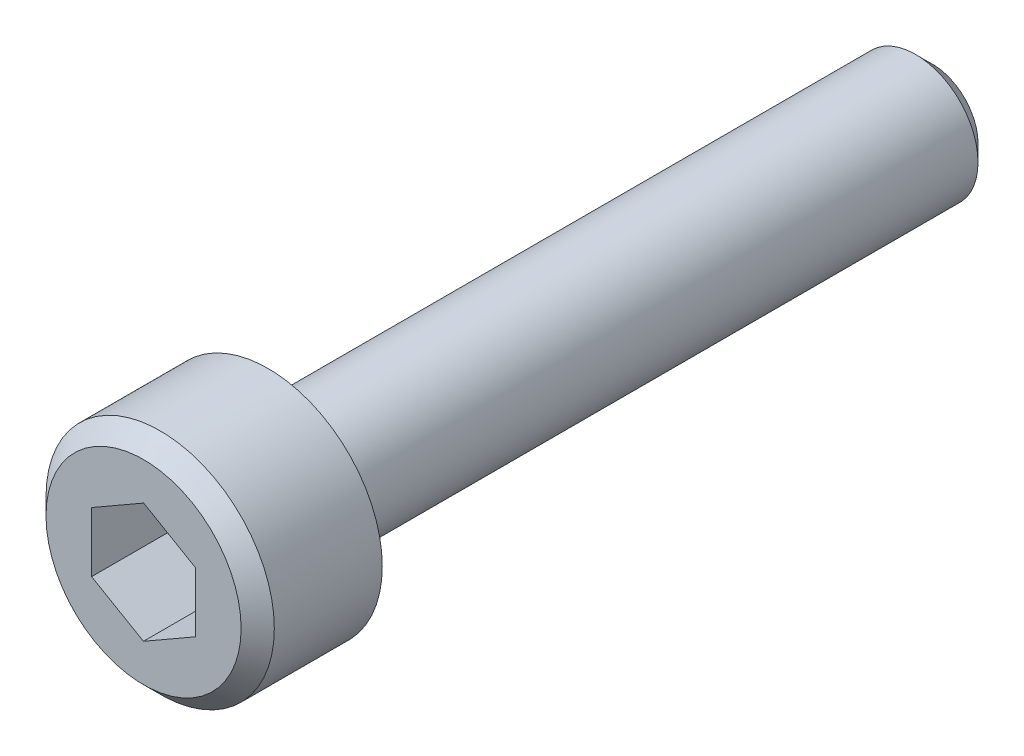
ISO-10303-21;
HEADER;
FILE_DESCRIPTION(('STEP AP214'),'2;1');
FILE_NAME('part.step','',(''),(''),'','','');
FILE_SCHEMA(('AUTOMOTIVE_DESIGN { 1 0 10303 214 1 1 1 1 }'));
ENDSEC;
DATA;
#1=APPLICATION_CONTEXT('core data for automotive mechanical design processes');
#2=APPLICATION_PROTOCOL_DEFINITION('international standard','automotive_design',2000,#1);
#3=PRODUCT_CONTEXT('',#1,'mechanical');
#4=PRODUCT('Part','Part','',(#3));
#5=PRODUCT_RELATED_PRODUCT_CATEGORY('part','',(#4));
#6=PRODUCT_DEFINITION_FORMATION('','',#4);
#7=PRODUCT_DEFINITION_CONTEXT('part definition',#1,'design');
#8=PRODUCT_DEFINITION('design','',#6,#7);
#9=PRODUCT_DEFINITION_SHAPE('','',#8);
#10=(LENGTH_UNIT() NAMED_UNIT(*) SI_UNIT(.MILLI.,.METRE.));
#11=(NAMED_UNIT(*) PLANE_ANGLE_UNIT() SI_UNIT($,.RADIAN.));
#12=(NAMED_UNIT(*) SI_UNIT($,.STERADIAN.) SOLID_ANGLE_UNIT());
#13=UNCERTAINTY_MEASURE_WITH_UNIT(LENGTH_MEASURE(1.E-05),#10,'distance_accuracy_value','');
#14=(GEOMETRIC_REPRESENTATION_CONTEXT(3) GLOBAL_UNCERTAINTY_ASSIGNED_CONTEXT((#13)) GLOBAL_UNIT_ASSIGNED_CONTEXT((#10,
#11,#12)) REPRESENTATION_CONTEXT('',''));
#15=CARTESIAN_POINT('',(0.,0.,0.));
#16=DIRECTION('',(0.,0.,1.));
#17=DIRECTION('',(1.,0.,0.));
#18=AXIS2_PLACEMENT_3D('',#15,#16,#17);
#19=CARTESIAN_POINT('',(-0.002966907876081,-1.44337262368073,0.5));
#20=DIRECTION('',(0.498218798968152,-0.867051341244988,0.));
#21=DIRECTION('',(0.867051341244988,0.498218798968152,0.));
#22=AXIS2_PLACEMENT_3D('',#19,#20,#21);
#23=PLANE('',#22);
#24=DIRECTION('',(0.,0.,1.));
#25=VECTOR('',#24,1.);
#26=CARTESIAN_POINT('',(1.24851390529647,-0.72425572943174,0.5));
#27=LINE('',#26,#25);
#28=CARTESIAN_POINT('',(1.24851390529647,-0.72425572943174,3.));
#29=VERTEX_POINT('',#28);
#30=CARTESIAN_POINT('',(1.24851390529647,-0.72425572943174,0.5));
#31=VERTEX_POINT('',#30);
#32=EDGE_CURVE('E82',#29,#31,#27,.F.);
#33=ORIENTED_EDGE('',*,*,#32,.T.);
#34=DIRECTION('',(0.867051341244988,0.498218798968152,0.));
#35=VECTOR('',#34,1.);
#36=CARTESIAN_POINT('',(-0.002966907876081,-1.44337262368073,0.5));
#37=LINE('',#36,#35);
#38=CARTESIAN_POINT('',(-0.0029669078760811,-1.44337262368073,0.5));
#39=VERTEX_POINT('',#38);
#40=EDGE_CURVE('E71',#39,#31,#37,.T.);
#41=ORIENTED_EDGE('',*,*,#40,.F.);
#42=DIRECTION('',(0.,0.,1.));
#43=VECTOR('',#42,1.);
#44=CARTESIAN_POINT('',(-0.00296690787608103,-1.44337262368073,0.5));
#45=LINE('',#44,#43);
#46=CARTESIAN_POINT('',(-0.00296690787608113,-1.44337262368073,3.));
#47=VERTEX_POINT('',#46);
#48=EDGE_CURVE('E91',#39,#47,#45,.T.);
#49=ORIENTED_EDGE('',*,*,#48,.T.);
#50=DIRECTION('',(0.867051341244988,0.498218798968152,0.));
#51=VECTOR('',#50,1.);
#52=CARTESIAN_POINT('',(-0.002966907876081,-1.44337262368073,3.));
#53=LINE('',#52,#51);
#54=EDGE_CURVE('E66',#29,#47,#53,.F.);
#55=ORIENTED_EDGE('',*,*,#54,.F.);
#56=EDGE_LOOP('',(#33,#41,#49,#55));
#57=FACE_BOUND('',#56,.T.);
#58=ADVANCED_FACE('F16',(#57),#23,.F.);
#59=CARTESIAN_POINT('',(1.24851390529647,-0.72425572943174,0.5));
#60=DIRECTION('',(0.999997887387606,-0.0020555340731014,0.));
#61=DIRECTION('',(0.0020555340731014,0.999997887387606,0.));
#62=AXIS2_PLACEMENT_3D('',#59,#60,#61);
#63=PLANE('',#62);
#64=DIRECTION('',(0.,0.,1.));
#65=VECTOR('',#64,1.);
#66=CARTESIAN_POINT('',(1.25148081317255,0.719116894248987,0.5));
#67=LINE('',#66,#65);
#68=CARTESIAN_POINT('',(1.25148081317255,0.719116894248987,3.));
#69=VERTEX_POINT('',#68);
#70=CARTESIAN_POINT('',(1.25148081317255,0.719116894248987,0.5));
#71=VERTEX_POINT('',#70);
#72=EDGE_CURVE('E87',#69,#71,#67,.F.);
#73=ORIENTED_EDGE('',*,*,#72,.T.);
#74=DIRECTION('',(0.0020555340731014,0.999997887387606,0.));
#75=VECTOR('',#74,1.);
#76=CARTESIAN_POINT('',(1.24851390529647,-0.72425572943174,0.5));
#77=LINE('',#76,#75);
#78=EDGE_CURVE('E75',#31,#71,#77,.T.);
#79=ORIENTED_EDGE('',*,*,#78,.F.);
#80=ORIENTED_EDGE('',*,*,#32,.F.);
#81=DIRECTION('',(0.0020555340731014,0.999997887387606,0.));
#82=VECTOR('',#81,1.);
#83=CARTESIAN_POINT('',(1.24851390529647,-0.72425572943174,3.));
#84=LINE('',#83,#82);
#85=EDGE_CURVE('E89',#69,#29,#84,.F.);
#86=ORIENTED_EDGE('',*,*,#85,.F.);
#87=EDGE_LOOP('',(#73,#79,#80,#86));
#88=FACE_BOUND('',#87,.T.);
#89=ADVANCED_FACE('F85',(#88),#63,.F.);
#90=CARTESIAN_POINT('',(-1.25148081317255,-0.719116894248988,0.5));
#91=DIRECTION('',(-0.501779088419452,-0.864995807171887,0.));
#92=DIRECTION('',(0.864995807171887,-0.501779088419452,0.));
#93=AXIS2_PLACEMENT_3D('',#90,#91,#92);
#94=PLANE('',#93);
#95=ORIENTED_EDGE('',*,*,#48,.F.);
#96=DIRECTION('',(0.864995807171887,-0.501779088419452,0.));
#97=VECTOR('',#96,1.);
#98=CARTESIAN_POINT('',(-1.25148081317255,-0.719116894248988,0.5));
#99=LINE('',#98,#97);
#100=CARTESIAN_POINT('',(-1.25148081317255,-0.719116894248988,0.5));
#101=VERTEX_POINT('',#100);
#102=EDGE_CURVE('E78',#101,#39,#99,.T.);
#103=ORIENTED_EDGE('',*,*,#102,.F.);
#104=DIRECTION('',(0.,0.,1.));
#105=VECTOR('',#104,1.);
#106=CARTESIAN_POINT('',(-1.25148081317255,-0.719116894248988,0.5));
#107=LINE('',#106,#105);
#108=CARTESIAN_POINT('',(-1.25148081317255,-0.719116894248988,3.));
#109=VERTEX_POINT('',#108);
#110=EDGE_CURVE('E122',#101,#109,#107,.T.);
#111=ORIENTED_EDGE('',*,*,#110,.T.);
#112=DIRECTION('',(0.864995807171887,-0.501779088419452,0.));
#113=VECTOR('',#112,1.);
#114=CARTESIAN_POINT('',(-1.25148081317255,-0.719116894248988,3.));
#115=LINE('',#114,#113);
#116=EDGE_CURVE('E134',#47,#109,#115,.F.);
#117=ORIENTED_EDGE('',*,*,#116,.F.);
#118=EDGE_LOOP('',(#95,#103,#111,#117));
#119=FACE_BOUND('',#118,.T.);
#120=ADVANCED_FACE('F137',(#119),#94,.F.);
#121=CARTESIAN_POINT('',(1.25148081317255,0.719116894248987,0.5));
#122=DIRECTION('',(0.501779088419452,0.864995807171887,0.));
#123=DIRECTION('',(-0.864995807171887,0.501779088419452,0.));
#124=AXIS2_PLACEMENT_3D('',#121,#122,#123);
#125=PLANE('',#124);
#126=DIRECTION('',(0.,0.,1.));
#127=VECTOR('',#126,1.);
#128=CARTESIAN_POINT('',(0.00296690787608411,1.44337262368073,0.5));
#129=LINE('',#128,#127);
#130=CARTESIAN_POINT('',(0.00296690787608401,1.44337262368073,3.));
#131=VERTEX_POINT('',#130);
#132=CARTESIAN_POINT('',(0.00296690787608401,1.44337262368073,0.5));
#133=VERTEX_POINT('',#132);
#134=EDGE_CURVE('E119',#131,#133,#129,.F.);
#135=ORIENTED_EDGE('',*,*,#134,.T.);
#136=DIRECTION('',(-0.864995807171887,0.501779088419452,0.));
#137=VECTOR('',#136,1.);
#138=CARTESIAN_POINT('',(1.25148081317255,0.719116894248987,0.5));
#139=LINE('',#138,#137);
#140=EDGE_CURVE('E128',#71,#133,#139,.T.);
#141=ORIENTED_EDGE('',*,*,#140,.F.);
#142=ORIENTED_EDGE('',*,*,#72,.F.);
#143=DIRECTION('',(-0.864995807171887,0.501779088419452,0.));
#144=VECTOR('',#143,1.);
#145=CARTESIAN_POINT('',(1.25148081317255,0.719116894248987,3.));
#146=LINE('',#145,#144);
#147=EDGE_CURVE('E130',#131,#69,#146,.F.);
#148=ORIENTED_EDGE('',*,*,#147,.F.);
#149=EDGE_LOOP('',(#135,#141,#142,#148));
#150=FACE_BOUND('',#149,.T.);
#151=ADVANCED_FACE('F144',(#150),#125,.F.);
#152=CARTESIAN_POINT('',(0.00296690787608422,1.44337262368073,0.5));
#153=DIRECTION('',(0.,0.,1.));
#154=DIRECTION('',(1.,0.,0.));
#155=AXIS2_PLACEMENT_3D('',#152,#153,#154);
#156=PLANE('',#155);
#157=ORIENTED_EDGE('',*,*,#40,.T.);
#158=ORIENTED_EDGE('',*,*,#78,.T.);
#159=ORIENTED_EDGE('',*,*,#140,.T.);
#160=DIRECTION('',(-0.867051341244987,-0.498218798968153,0.));
#161=VECTOR('',#160,1.);
#162=CARTESIAN_POINT('',(0.002966907876084,1.44337262368073,0.5));
#163=LINE('',#162,#161);
#164=CARTESIAN_POINT('',(-1.24851390529646,0.724255729431739,0.5));
#165=VERTEX_POINT('',#164);
#166=EDGE_CURVE('E117',#133,#165,#163,.T.);
#167=ORIENTED_EDGE('',*,*,#166,.T.);
#168=DIRECTION('',(-0.0020555340731014,-0.999997887387606,0.));
#169=VECTOR('',#168,1.);
#170=CARTESIAN_POINT('',(-1.24851390529646,0.724255729431739,0.5));
#171=LINE('',#170,#169);
#172=EDGE_CURVE('E125',#165,#101,#171,.T.);
#173=ORIENTED_EDGE('',*,*,#172,.T.);
#174=ORIENTED_EDGE('',*,*,#102,.T.);
#175=EDGE_LOOP('',(#157,#158,#159,#167,#173,#174));
#176=FACE_BOUND('',#175,.T.);
#177=ADVANCED_FACE('F72',(#176),#156,.T.);
#178=CARTESIAN_POINT('',(-1.24851390529646,0.724255729431739,0.5));
#179=DIRECTION('',(-0.999997887387606,0.0020555340731014,0.));
#180=DIRECTION('',(-0.0020555340731014,-0.999997887387606,0.));
#181=AXIS2_PLACEMENT_3D('',#178,#179,#180);
#182=PLANE('',#181);
#183=ORIENTED_EDGE('',*,*,#110,.F.);
#184=ORIENTED_EDGE('',*,*,#172,.F.);
#185=DIRECTION('',(0.,0.,1.));
#186=VECTOR('',#185,1.);
#187=CARTESIAN_POINT('',(-1.24851390529646,0.724255729431739,0.5));
#188=LINE('',#187,#186);
#189=CARTESIAN_POINT('',(-1.24851390529646,0.724255729431739,3.));
#190=VERTEX_POINT('',#189);
#191=EDGE_CURVE('E115',#165,#190,#188,.T.);
#192=ORIENTED_EDGE('',*,*,#191,.T.);
#193=DIRECTION('',(-0.0020555340731014,-0.999997887387606,0.));
#194=VECTOR('',#193,1.);
#195=CARTESIAN_POINT('',(-1.24851390529646,0.724255729431739,3.));
#196=LINE('',#195,#194);
#197=EDGE_CURVE('E34',#109,#190,#196,.F.);
#198=ORIENTED_EDGE('',*,*,#197,.F.);
#199=EDGE_LOOP('',(#183,#184,#192,#198));
#200=FACE_BOUND('',#199,.T.);
#201=ADVANCED_FACE('F151',(#200),#182,.F.);
#202=CARTESIAN_POINT('',(0.002966907876084,1.44337262368073,0.5));
#203=DIRECTION('',(-0.498218798968153,0.867051341244987,0.));
#204=DIRECTION('',(-0.867051341244987,-0.498218798968153,0.));
#205=AXIS2_PLACEMENT_3D('',#202,#203,#204);
#206=PLANE('',#205);
#207=ORIENTED_EDGE('',*,*,#191,.F.);
#208=ORIENTED_EDGE('',*,*,#166,.F.);
#209=ORIENTED_EDGE('',*,*,#134,.F.);
#210=DIRECTION('',(0.867051341244987,0.498218798968153,0.));
#211=VECTOR('',#210,1.);
#212=CARTESIAN_POINT('',(-1.24851390529646,0.724255729431739,3.));
#213=LINE('',#212,#211);
#214=EDGE_CURVE('E111',#190,#131,#213,.T.);
#215=ORIENTED_EDGE('',*,*,#214,.F.);
#216=EDGE_LOOP('',(#207,#208,#209,#215));
#217=FACE_BOUND('',#216,.T.);
#218=ADVANCED_FACE('F149',(#217),#206,.F.);
#219=CARTESIAN_POINT('',(0.,0.,3.));
#220=DIRECTION('',(0.,0.,1.));
#221=DIRECTION('',(1.,0.,0.));
#222=AXIS2_PLACEMENT_3D('',#219,#220,#221);
#223=PLANE('',#222);
#224=ORIENTED_EDGE('',*,*,#197,.T.);
#225=ORIENTED_EDGE('',*,*,#214,.T.);
#226=ORIENTED_EDGE('',*,*,#147,.T.);
#227=ORIENTED_EDGE('',*,*,#85,.T.);
#228=ORIENTED_EDGE('',*,*,#54,.T.);
#229=ORIENTED_EDGE('',*,*,#116,.T.);
#230=EDGE_LOOP('',(#224,#225,#226,#227,#228,#229));
#231=FACE_BOUND('',#230,.T.);
#232=CARTESIAN_POINT('',(0.,0.,2.9999999999859));
#233=DIRECTION('',(0.,0.,-1.));
#234=DIRECTION('',(-1.,0.,0.));
#235=AXIS2_PLACEMENT_3D('',#232,#233,#234);
#236=CIRCLE('',#235,2.35000000037644);
#237=CARTESIAN_POINT('',(-2.35000000037644,0.,2.9999999999859));
#238=VERTEX_POINT('',#237);
#239=EDGE_CURVE('E19',#238,#238,#236,.T.);
#240=ORIENTED_EDGE('',*,*,#239,.F.);
#241=EDGE_LOOP('',(#240));
#242=FACE_BOUND('',#241,.T.);
#243=ADVANCED_FACE('F139',(#231,#242),#223,.T.);
#244=CARTESIAN_POINT('',(0.,0.,2.59999999963156));
#245=DIRECTION('',(0.,0.,-1.));
#246=DIRECTION('',(-1.,0.,0.));
#247=AXIS2_PLACEMENT_3D('',#244,#245,#246);
#248=CONICAL_SURFACE('',#247,2.74999999999181,0.785398162473743);
#249=ORIENTED_EDGE('',*,*,#239,.T.);
#250=EDGE_LOOP('',(#249));
#251=FACE_BOUND('',#250,.T.);
#252=CARTESIAN_POINT('',(0.,0.,2.59999999964102));
#253=DIRECTION('',(0.,0.,1.));
#254=DIRECTION('',(1.,0.,0.));
#255=AXIS2_PLACEMENT_3D('',#252,#253,#254);
#256=CIRCLE('',#255,2.75);
#257=CARTESIAN_POINT('',(2.75,0.,2.59999999964102));
#258=VERTEX_POINT('',#257);
#259=EDGE_CURVE('E103',#258,#258,#256,.F.);
#260=ORIENTED_EDGE('',*,*,#259,.F.);
#261=EDGE_LOOP('',(#260));
#262=FACE_BOUND('',#261,.T.);
#263=ADVANCED_FACE('F187',(#251,#262),#248,.T.);
#264=CARTESIAN_POINT('',(0.,0.,0.));
#265=DIRECTION('',(0.,0.,1.));
#266=DIRECTION('',(1.,0.,0.));
#267=AXIS2_PLACEMENT_3D('',#264,#265,#266);
#268=CYLINDRICAL_SURFACE('',#267,2.75);
#269=CARTESIAN_POINT('',(0.,0.,0.));
#270=DIRECTION('',(0.,0.,1.));
#271=DIRECTION('',(1.,0.,0.));
#272=AXIS2_PLACEMENT_3D('',#269,#270,#271);
#273=CIRCLE('',#272,2.75);
#274=CARTESIAN_POINT('',(2.75,0.,0.));
#275=VERTEX_POINT('',#274);
#276=EDGE_CURVE('E101',#275,#275,#273,.F.);
#277=ORIENTED_EDGE('',*,*,#276,.F.);
#278=EDGE_LOOP('',(#277));
#279=FACE_BOUND('',#278,.T.);
#280=ORIENTED_EDGE('',*,*,#259,.T.);
#281=EDGE_LOOP('',(#280));
#282=FACE_BOUND('',#281,.T.);
#283=ADVANCED_FACE('F183',(#279,#282),#268,.T.);
#284=CARTESIAN_POINT('',(0.,0.,-16.));
#285=DIRECTION('',(0.,0.,-1.));
#286=DIRECTION('',(-1.,0.,0.));
#287=AXIS2_PLACEMENT_3D('',#284,#285,#286);
#288=PLANE('',#287);
#289=CARTESIAN_POINT('',(0.,0.,-16.0000000000764));
#290=DIRECTION('',(0.,0.,1.));
#291=DIRECTION('',(0.,-1.,0.));
#292=AXIS2_PLACEMENT_3D('',#289,#290,#291);
#293=CIRCLE('',#292,1.10000000000809);
#294=CARTESIAN_POINT('',(0.,-1.10000000000809,-16.0000000000764));
#295=VERTEX_POINT('',#294);
#296=EDGE_CURVE('E99',#295,#295,#293,.T.);
#297=ORIENTED_EDGE('',*,*,#296,.F.);
#298=EDGE_LOOP('',(#297));
#299=FACE_BOUND('',#298,.T.);
#300=ADVANCED_FACE('F180',(#299),#288,.T.);
#301=CARTESIAN_POINT('',(2.75,0.,0.));
#302=DIRECTION('',(0.,0.,-1.));
#303=DIRECTION('',(-1.,0.,0.));
#304=AXIS2_PLACEMENT_3D('',#301,#302,#303);
#305=PLANE('',#304);
#306=ORIENTED_EDGE('',*,*,#276,.T.);
#307=EDGE_LOOP('',(#306));
#308=FACE_BOUND('',#307,.T.);
#309=CARTESIAN_POINT('',(0.,0.,-5.6843418860808E-11));
#310=DIRECTION('',(0.,0.,1.));
#311=DIRECTION('',(1.,0.,0.));
#312=AXIS2_PLACEMENT_3D('',#309,#310,#311);
#313=CIRCLE('',#312,1.59999999993943);
#314=CARTESIAN_POINT('',(1.59999999993943,0.,-5.6843418860808E-11));
#315=VERTEX_POINT('',#314);
#316=EDGE_CURVE('E96',#315,#315,#313,.F.);
#317=ORIENTED_EDGE('',*,*,#316,.F.);
#318=EDGE_LOOP('',(#317));
#319=FACE_BOUND('',#318,.T.);
#320=ADVANCED_FACE('F176',(#308,#319),#305,.T.);
#321=CARTESIAN_POINT('',(0.,0.,-15.60000000012));
#322=DIRECTION('',(0.,0.,1.));
#323=DIRECTION('',(0.,-1.,0.));
#324=AXIS2_PLACEMENT_3D('',#321,#322,#323);
#325=CONICAL_SURFACE('',#324,1.49999999990769,0.785398163326394);
#326=CARTESIAN_POINT('',(0.,0.,-15.6));
#327=DIRECTION('',(0.,0.,1.));
#328=DIRECTION('',(1.,0.,0.));
#329=AXIS2_PLACEMENT_3D('',#326,#327,#328);
#330=CIRCLE('',#329,1.5);
#331=CARTESIAN_POINT('',(1.5,0.,-15.6));
#332=VERTEX_POINT('',#331);
#333=EDGE_CURVE('E25',#332,#332,#330,.T.);
#334=ORIENTED_EDGE('',*,*,#333,.F.);
#335=EDGE_LOOP('',(#334));
#336=FACE_BOUND('',#335,.T.);
#337=ORIENTED_EDGE('',*,*,#296,.T.);
#338=EDGE_LOOP('',(#337));
#339=FACE_BOUND('',#338,.T.);
#340=ADVANCED_FACE('F169',(#336,#339),#325,.T.);
#341=CARTESIAN_POINT('',(0.,0.,-5.6843418860808E-11));
#342=DIRECTION('',(0.,0.,1.));
#343=DIRECTION('',(1.,0.,0.));
#344=AXIS2_PLACEMENT_3D('',#341,#342,#343);
#345=CONICAL_SURFACE('',#344,1.59999999993943,0.785398162544797);
#346=ORIENTED_EDGE('',*,*,#316,.T.);
#347=EDGE_LOOP('',(#346));
#348=FACE_BOUND('',#347,.T.);
#349=CARTESIAN_POINT('',(0.,0.,-0.100000000089744));
#350=DIRECTION('',(0.,0.,1.));
#351=DIRECTION('',(1.,0.,0.));
#352=AXIS2_PLACEMENT_3D('',#349,#350,#351);
#353=CIRCLE('',#352,1.5);
#354=CARTESIAN_POINT('',(1.5,0.,-0.100000000089744));
#355=VERTEX_POINT('',#354);
#356=EDGE_CURVE('E11',#355,#355,#353,.F.);
#357=ORIENTED_EDGE('',*,*,#356,.F.);
#358=EDGE_LOOP('',(#357));
#359=FACE_BOUND('',#358,.T.);
#360=ADVANCED_FACE('F163',(#348,#359),#345,.T.);
#361=CARTESIAN_POINT('',(0.,0.,-16.));
#362=DIRECTION('',(0.,0.,1.));
#363=DIRECTION('',(1.,0.,0.));
#364=AXIS2_PLACEMENT_3D('',#361,#362,#363);
#365=CYLINDRICAL_SURFACE('',#364,1.5);
#366=ORIENTED_EDGE('',*,*,#356,.T.);
#367=EDGE_LOOP('',(#366));
#368=FACE_BOUND('',#367,.T.);
#369=ORIENTED_EDGE('',*,*,#333,.T.);
#370=EDGE_LOOP('',(#369));
#371=FACE_BOUND('',#370,.T.);
#372=ADVANCED_FACE('F161',(#368,#371),#365,.T.);
#373=CLOSED_SHELL('',(#58,#89,#120,#151,#177,#201,#218,#243,#263,#283,#300,#320,#340,#360,#372));
#374=MANIFOLD_SOLID_BREP('B1',#373);
#375=ADVANCED_BREP_SHAPE_REPRESENTATION('',(#18,#374),#14);
#376=SHAPE_DEFINITION_REPRESENTATION(#9,#375);
ENDSEC;
END-ISO-10303-21;
